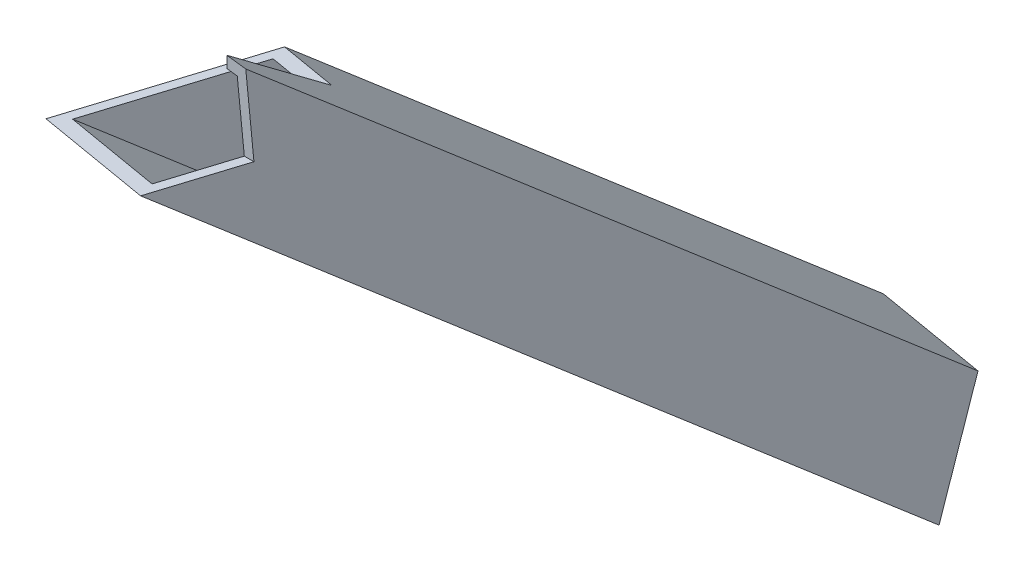
ISO-10303-21;
HEADER;
FILE_DESCRIPTION(('STEP AP214'),'2;1');
FILE_NAME('part.step','',(''),(''),'','','');
FILE_SCHEMA(('AUTOMOTIVE_DESIGN { 1 0 10303 214 1 1 1 1 }'));
ENDSEC;
DATA;
#1=APPLICATION_CONTEXT('core data for automotive mechanical design processes');
#2=APPLICATION_PROTOCOL_DEFINITION('international standard','automotive_design',2000,#1);
#3=PRODUCT_CONTEXT('',#1,'mechanical');
#4=PRODUCT('Part','Part','',(#3));
#5=PRODUCT_RELATED_PRODUCT_CATEGORY('part','',(#4));
#6=PRODUCT_DEFINITION_FORMATION('','',#4);
#7=PRODUCT_DEFINITION_CONTEXT('part definition',#1,'design');
#8=PRODUCT_DEFINITION('design','',#6,#7);
#9=PRODUCT_DEFINITION_SHAPE('','',#8);
#10=(LENGTH_UNIT() NAMED_UNIT(*) SI_UNIT(.MILLI.,.METRE.));
#11=(NAMED_UNIT(*) PLANE_ANGLE_UNIT() SI_UNIT($,.RADIAN.));
#12=(NAMED_UNIT(*) SI_UNIT($,.STERADIAN.) SOLID_ANGLE_UNIT());
#13=UNCERTAINTY_MEASURE_WITH_UNIT(LENGTH_MEASURE(1.E-05),#10,'distance_accuracy_value','');
#14=(GEOMETRIC_REPRESENTATION_CONTEXT(3) GLOBAL_UNCERTAINTY_ASSIGNED_CONTEXT((#13)) GLOBAL_UNIT_ASSIGNED_CONTEXT((#10,
#11,#12)) REPRESENTATION_CONTEXT('',''));
#15=CARTESIAN_POINT('',(0.,0.,0.));
#16=DIRECTION('',(0.,0.,1.));
#17=DIRECTION('',(1.,0.,0.));
#18=AXIS2_PLACEMENT_3D('',#15,#16,#17);
#19=CARTESIAN_POINT('',(-139.490711985,8.9814239699996,-452.98142397));
#20=DIRECTION('',(-0.101857603000028,-0.796284793999944,0.596284793999943));
#21=DIRECTION('',(0.,-0.599402291854355,-0.800447932422682));
#22=AXIS2_PLACEMENT_3D('',#19,#20,#21);
#23=PLANE('',#22);
#24=DIRECTION('',(-0.991917792269427,0.126882202768336,0.));
#25=VECTOR('',#24,1.);
#26=CARTESIAN_POINT('',(-140.152182836034,3.81029128241337,-460.));
#27=LINE('',#26,#25);
#28=CARTESIAN_POINT('',(-136.683281573,3.36656314599933,-460.));
#29=VERTEX_POINT('',#28);
#30=CARTESIAN_POINT('',(-140.,3.7908246556324,-460.));
#31=VERTEX_POINT('',#30);
#32=EDGE_CURVE('E58',#29,#31,#27,.T.);
#33=ORIENTED_EDGE('',*,*,#32,.F.);
#34=DIRECTION('',(0.298142396999973,-0.596284793999944,-0.74535599249993));
#35=VECTOR('',#34,1.);
#36=CARTESIAN_POINT('',(-139.490711985,8.9814239699996,-452.98142397));
#37=LINE('',#36,#35);
#38=CARTESIAN_POINT('',(-100.,-70.0000000000001,-551.708203932499));
#39=VERTEX_POINT('',#38);
#40=EDGE_CURVE('E212',#29,#39,#37,.T.);
#41=ORIENTED_EDGE('',*,*,#40,.T.);
#42=DIRECTION('',(0.985721919281302,0.,0.168381405886715));
#43=VECTOR('',#42,1.);
#44=CARTESIAN_POINT('',(-121.984660849387,-70.0000000000001,-555.463632344258));
#45=LINE('',#44,#43);
#46=CARTESIAN_POINT('',(-120.,-70.0000000000002,-555.124611797498));
#47=VERTEX_POINT('',#46);
#48=EDGE_CURVE('E187',#47,#39,#45,.T.);
#49=ORIENTED_EDGE('',*,*,#48,.F.);
#50=DIRECTION('',(0.298142396999973,-0.596284793999944,-0.74535599249993));
#51=VECTOR('',#50,1.);
#52=CARTESIAN_POINT('',(-158.472135955,6.94427190999894,-458.944271909999));
#53=LINE('',#52,#51);
#54=CARTESIAN_POINT('',(-150.,-10.,-480.124611797498));
#55=VERTEX_POINT('',#54);
#56=EDGE_CURVE('E170',#55,#47,#53,.T.);
#57=ORIENTED_EDGE('',*,*,#56,.F.);
#58=DIRECTION('',(-0.985721919281302,0.,-0.168381405886715));
#59=VECTOR('',#58,1.);
#60=CARTESIAN_POINT('',(-135.283522978484,-10.,-477.610737405429));
#61=LINE('',#60,#59);
#62=CARTESIAN_POINT('',(-140.,-10.,-478.416407864999));
#63=VERTEX_POINT('',#62);
#64=EDGE_CURVE('E199',#63,#55,#61,.T.);
#65=ORIENTED_EDGE('',*,*,#64,.F.);
#66=DIRECTION('',(0.,-0.599402291854355,-0.800447932422682));
#67=VECTOR('',#66,1.);
#68=CARTESIAN_POINT('',(-140.,9.02316418288764,-453.012680443099));
#69=LINE('',#68,#67);
#70=EDGE_CURVE('E80',#31,#63,#69,.T.);
#71=ORIENTED_EDGE('',*,*,#70,.F.);
#72=EDGE_LOOP('',(#33,#41,#49,#57,#65,#71));
#73=FACE_BOUND('',#72,.T.);
#74=ADVANCED_FACE('F41',(#73),#23,.F.);
#75=CARTESIAN_POINT('',(-141.527864045001,-6.94427190999933,-441.055728090001));
#76=DIRECTION('',(-0.949071198499986,-0.101857603000028,-0.298142396999973));
#77=DIRECTION('',(-0.299701145927178,0.,0.954033135236893));
#78=AXIS2_PLACEMENT_3D('',#75,#76,#77);
#79=PLANE('',#78);
#80=DIRECTION('',(0.299701145927178,0.,-0.954033135236893));
#81=VECTOR('',#80,1.);
#82=CARTESIAN_POINT('',(-141.229369580434,-10.,-440.961958670701));
#83=LINE('',#82,#81);
#84=CARTESIAN_POINT('',(-140.,-10.,-444.875388202502));
#85=VERTEX_POINT('',#84);
#86=CARTESIAN_POINT('',(-135.248735793345,-10.,-460.));
#87=VERTEX_POINT('',#86);
#88=EDGE_CURVE('E160',#85,#87,#83,.T.);
#89=ORIENTED_EDGE('',*,*,#88,.F.);
#90=DIRECTION('',(0.298142396999973,-0.596284793999944,-0.74535599249993));
#91=VECTOR('',#90,1.);
#92=CARTESIAN_POINT('',(-141.527864045001,-6.94427190999933,-441.055728090001));
#93=LINE('',#92,#91);
#94=CARTESIAN_POINT('',(-100.,-90.0000000000002,-544.875388202502));
#95=VERTEX_POINT('',#94);
#96=EDGE_CURVE('E210',#85,#95,#93,.T.);
#97=ORIENTED_EDGE('',*,*,#96,.T.);
#98=DIRECTION('',(0.,-0.94629851540018,0.32329416906498));
#99=VECTOR('',#98,1.);
#100=CARTESIAN_POINT('',(-100.,-47.3870220062147,-559.433719519401));
#101=LINE('',#100,#99);
#102=EDGE_CURVE('E183',#39,#95,#101,.T.);
#103=ORIENTED_EDGE('',*,*,#102,.F.);
#104=ORIENTED_EDGE('',*,*,#40,.F.);
#105=DIRECTION('',(-0.106710653684535,0.9942901168121,0.));
#106=VECTOR('',#105,1.);
#107=CARTESIAN_POINT('',(-135.644454124513,-6.31284401195058,-460.));
#108=LINE('',#107,#106);
#109=EDGE_CURVE('E167',#87,#29,#108,.T.);
#110=ORIENTED_EDGE('',*,*,#109,.F.);
#111=EDGE_LOOP('',(#89,#97,#103,#104,#110));
#112=FACE_BOUND('',#111,.T.);
#113=ADVANCED_FACE('F231',(#112),#79,.F.);
#114=CARTESIAN_POINT('',(-142.883405797801,-5.83318840439948,-442.486811595601));
#115=DIRECTION('',(-0.949071198499986,-0.101857603000028,-0.298142396999973));
#116=DIRECTION('',(-0.299701145927178,0.,0.954033135236893));
#117=AXIS2_PLACEMENT_3D('',#114,#115,#116);
#118=PLANE('',#117);
#119=DIRECTION('',(0.299701145927178,0.,-0.954033135236893));
#120=VECTOR('',#119,1.);
#121=CARTESIAN_POINT('',(-142.476376716826,-10.,-442.358946978023));
#122=LINE('',#121,#120);
#123=CARTESIAN_POINT('',(-140.8,-10.,-447.695326090101));
#124=VERTEX_POINT('',#123);
#125=CARTESIAN_POINT('',(-136.93459455982,-10.,-460.));
#126=VERTEX_POINT('',#125);
#127=EDGE_CURVE('E121',#124,#126,#122,.T.);
#128=ORIENTED_EDGE('',*,*,#127,.T.);
#129=DIRECTION('',(-0.106710653684535,0.9942901168121,0.));
#130=VECTOR('',#129,1.);
#131=CARTESIAN_POINT('',(-137.444438975147,-5.24945967653611,-460.));
#132=LINE('',#131,#130);
#133=CARTESIAN_POINT('',(-138.17395652132,1.54791304263929,-460.));
#134=VERTEX_POINT('',#133);
#135=EDGE_CURVE('E146',#126,#134,#132,.T.);
#136=ORIENTED_EDGE('',*,*,#135,.T.);
#137=DIRECTION('',(0.298142396999973,-0.596284793999944,-0.74535599249993));
#138=VECTOR('',#137,1.);
#139=CARTESIAN_POINT('',(-141.1721980674,7.54439613479954,-452.5043961348));
#140=LINE('',#139,#138);
#141=CARTESIAN_POINT('',(-101.6,-71.6000000000002,-551.434891303299));
#142=VERTEX_POINT('',#141);
#143=EDGE_CURVE('E150',#134,#142,#140,.T.);
#144=ORIENTED_EDGE('',*,*,#143,.T.);
#145=DIRECTION('',(0.,-0.94629851540018,0.32329416906498));
#146=VECTOR('',#145,1.);
#147=CARTESIAN_POINT('',(-101.6,-46.0378678936181,-560.167958220738));
#148=LINE('',#147,#146);
#149=CARTESIAN_POINT('',(-101.6,-88.4000000000002,-545.695326090102));
#150=VERTEX_POINT('',#149);
#151=EDGE_CURVE('E173',#142,#150,#148,.T.);
#152=ORIENTED_EDGE('',*,*,#151,.T.);
#153=DIRECTION('',(0.298142396999973,-0.596284793999944,-0.74535599249993));
#154=VECTOR('',#153,1.);
#155=CARTESIAN_POINT('',(-142.883405797801,-5.83318840439948,-442.486811595601));
#156=LINE('',#155,#154);
#157=EDGE_CURVE('E149',#124,#150,#156,.T.);
#158=ORIENTED_EDGE('',*,*,#157,.F.);
#159=EDGE_LOOP('',(#128,#136,#144,#152,#158));
#160=FACE_BOUND('',#159,.T.);
#161=ADVANCED_FACE('F145',(#160),#118,.T.);
#162=CARTESIAN_POINT('',(-141.1721980674,7.54439613479954,-452.5043961348));
#163=DIRECTION('',(-0.101857603000028,-0.796284793999944,0.596284793999943));
#164=DIRECTION('',(0.,-0.599402291854355,-0.800447932422682));
#165=AXIS2_PLACEMENT_3D('',#162,#163,#164);
#166=PLANE('',#165);
#167=ORIENTED_EDGE('',*,*,#143,.F.);
#168=DIRECTION('',(-0.991917792269427,0.126882202768336,0.));
#169=VECTOR('',#168,1.);
#170=CARTESIAN_POINT('',(-141.878626757,2.02179981399953,-460.));
#171=LINE('',#170,#169);
#172=CARTESIAN_POINT('',(-140.,1.7814933057734,-460.));
#173=VERTEX_POINT('',#172);
#174=EDGE_CURVE('E157',#134,#173,#171,.T.);
#175=ORIENTED_EDGE('',*,*,#174,.T.);
#176=DIRECTION('',(0.,-0.599402291854355,-0.800447932422682));
#177=VECTOR('',#176,1.);
#178=CARTESIAN_POINT('',(-140.,7.44832515837925,-452.432454961471));
#179=LINE('',#178,#177);
#180=CARTESIAN_POINT('',(-140.,-10.,-475.733126291999));
#181=VERTEX_POINT('',#180);
#182=EDGE_CURVE('E67',#173,#181,#179,.T.);
#183=ORIENTED_EDGE('',*,*,#182,.T.);
#184=DIRECTION('',(-0.985721919281302,0.,-0.168381405886715));
#185=VECTOR('',#184,1.);
#186=CARTESIAN_POINT('',(-137.283522978484,-10.,-475.269096618929));
#187=LINE('',#186,#185);
#188=CARTESIAN_POINT('',(-149.2,-10.,-477.304673909898));
#189=VERTEX_POINT('',#188);
#190=EDGE_CURVE('E172',#181,#189,#187,.T.);
#191=ORIENTED_EDGE('',*,*,#190,.T.);
#192=DIRECTION('',(0.298142396999973,-0.596284793999944,-0.74535599249993));
#193=VECTOR('',#192,1.);
#194=CARTESIAN_POINT('',(-157.1165942022,5.83318840439909,-457.513188404399));
#195=LINE('',#194,#193);
#196=CARTESIAN_POINT('',(-118.4,-71.6000000000002,-554.304673909898));
#197=VERTEX_POINT('',#196);
#198=EDGE_CURVE('E195',#189,#197,#195,.T.);
#199=ORIENTED_EDGE('',*,*,#198,.T.);
#200=DIRECTION('',(0.985721919281302,0.,0.168381405886715));
#201=VECTOR('',#200,1.);
#202=CARTESIAN_POINT('',(-123.630024525945,-71.6000000000002,-555.198068756127));
#203=LINE('',#202,#201);
#204=EDGE_CURVE('E176',#197,#142,#203,.T.);
#205=ORIENTED_EDGE('',*,*,#204,.T.);
#206=EDGE_LOOP('',(#167,#175,#183,#191,#199,#205));
#207=FACE_BOUND('',#206,.T.);
#208=ADVANCED_FACE('F233',(#207),#166,.T.);
#209=CARTESIAN_POINT('',(-140.,-10.,-825.));
#210=DIRECTION('',(-1.,0.,0.));
#211=DIRECTION('',(0.,0.,1.));
#212=AXIS2_PLACEMENT_3D('',#209,#210,#211);
#213=PLANE('',#212);
#214=ORIENTED_EDGE('',*,*,#182,.F.);
#215=DIRECTION('',(0.,1.,0.));
#216=VECTOR('',#215,1.);
#217=CARTESIAN_POINT('',(-140.,-10.,-460.));
#218=LINE('',#217,#216);
#219=EDGE_CURVE('E161',#173,#31,#218,.T.);
#220=ORIENTED_EDGE('',*,*,#219,.T.);
#221=ORIENTED_EDGE('',*,*,#70,.T.);
#222=DIRECTION('',(0.,0.,1.));
#223=VECTOR('',#222,1.);
#224=CARTESIAN_POINT('',(-140.,-10.,-825.));
#225=LINE('',#224,#223);
#226=EDGE_CURVE('E198',#63,#181,#225,.T.);
#227=ORIENTED_EDGE('',*,*,#226,.T.);
#228=EDGE_LOOP('',(#214,#220,#221,#227));
#229=FACE_BOUND('',#228,.T.);
#230=ADVANCED_FACE('F232',(#229),#213,.T.);
#231=CARTESIAN_POINT('',(-160.509288015,-8.98142396999999,-447.01857603));
#232=DIRECTION('',(0.949071198499986,0.101857603000028,0.298142396999973));
#233=DIRECTION('',(0.299701145927178,0.,-0.954033135236893));
#234=AXIS2_PLACEMENT_3D('',#231,#232,#233);
#235=PLANE('',#234);
#236=DIRECTION('',(-0.299701145927178,0.,0.954033135236893));
#237=VECTOR('',#236,1.);
#238=CARTESIAN_POINT('',(-160.409789860145,-10.,-446.987319556901));
#239=LINE('',#238,#237);
#240=CARTESIAN_POINT('',(-160.,-10.0000000000002,-448.291796067501));
#241=VERTEX_POINT('',#240);
#242=EDGE_CURVE('E50',#55,#241,#239,.T.);
#243=ORIENTED_EDGE('',*,*,#242,.F.);
#244=ORIENTED_EDGE('',*,*,#56,.T.);
#245=DIRECTION('',(0.,0.94629851540018,-0.32329416906498));
#246=VECTOR('',#245,1.);
#247=CARTESIAN_POINT('',(-120.,-48.432213203729,-562.493047441638));
#248=LINE('',#247,#246);
#249=CARTESIAN_POINT('',(-120.,-90.0000000000002,-548.291796067501));
#250=VERTEX_POINT('',#249);
#251=EDGE_CURVE('E182',#250,#47,#248,.T.);
#252=ORIENTED_EDGE('',*,*,#251,.F.);
#253=DIRECTION('',(0.298142396999973,-0.596284793999944,-0.74535599249993));
#254=VECTOR('',#253,1.);
#255=CARTESIAN_POINT('',(-160.509288015,-8.98142396999999,-447.01857603));
#256=LINE('',#255,#254);
#257=EDGE_CURVE('E45',#241,#250,#256,.T.);
#258=ORIENTED_EDGE('',*,*,#257,.F.);
#259=EDGE_LOOP('',(#243,#244,#252,#258));
#260=FACE_BOUND('',#259,.T.);
#261=ADVANCED_FACE('F217',(#260),#235,.F.);
#262=CARTESIAN_POINT('',(-141.527864045001,-6.94427190999933,-441.055728090001));
#263=DIRECTION('',(0.101857603000028,0.796284793999944,-0.596284793999943));
#264=DIRECTION('',(0.,0.599402291854355,0.800447932422682));
#265=AXIS2_PLACEMENT_3D('',#262,#263,#264);
#266=PLANE('',#265);
#267=DIRECTION('',(0.985721919281302,0.,0.168381405886715));
#268=VECTOR('',#267,1.);
#269=CARTESIAN_POINT('',(-140.850568935452,-10.,-445.020682722542));
#270=LINE('',#269,#268);
#271=EDGE_CURVE('E11',#241,#85,#270,.T.);
#272=ORIENTED_EDGE('',*,*,#271,.F.);
#273=ORIENTED_EDGE('',*,*,#257,.T.);
#274=DIRECTION('',(-0.985721919281302,0.,-0.168381405886715));
#275=VECTOR('',#274,1.);
#276=CARTESIAN_POINT('',(-123.118752763323,-90.0000000000002,-548.824542640981));
#277=LINE('',#276,#275);
#278=EDGE_CURVE('E179',#95,#250,#277,.T.);
#279=ORIENTED_EDGE('',*,*,#278,.F.);
#280=ORIENTED_EDGE('',*,*,#96,.F.);
#281=EDGE_LOOP('',(#272,#273,#279,#280));
#282=FACE_BOUND('',#281,.T.);
#283=ADVANCED_FACE('F229',(#282),#266,.F.);
#284=CARTESIAN_POINT('',(-142.883405797801,-5.83318840439948,-442.486811595601));
#285=DIRECTION('',(0.101857603000027,0.796284793999944,-0.596284793999944));
#286=DIRECTION('',(0.,0.599402291854356,0.800447932422682));
#287=AXIS2_PLACEMENT_3D('',#284,#285,#286);
#288=PLANE('',#287);
#289=DIRECTION('',(0.298142396999973,-0.596284793999944,-0.74535599249993));
#290=VECTOR('',#289,1.);
#291=CARTESIAN_POINT('',(-158.8278019326,-7.54439613479993,-447.4956038652));
#292=LINE('',#291,#290);
#293=CARTESIAN_POINT('',(-157.6,-10.,-450.5651086967));
#294=VERTEX_POINT('',#293);
#295=CARTESIAN_POINT('',(-118.4,-88.4000000000002,-548.5651086967));
#296=VERTEX_POINT('',#295);
#297=EDGE_CURVE('E92',#294,#296,#292,.T.);
#298=ORIENTED_EDGE('',*,*,#297,.F.);
#299=DIRECTION('',(0.985721919281302,0.,0.168381405886712));
#300=VECTOR('',#299,1.);
#301=CARTESIAN_POINT('',(-141.959841582337,-10.,-447.893450685304));
#302=LINE('',#301,#300);
#303=EDGE_CURVE('E202',#294,#124,#302,.T.);
#304=ORIENTED_EDGE('',*,*,#303,.T.);
#305=ORIENTED_EDGE('',*,*,#157,.T.);
#306=DIRECTION('',(-0.985721919281302,0.,-0.168381405886714));
#307=VECTOR('',#306,1.);
#308=CARTESIAN_POINT('',(-124.58266173365,-88.4000000000002,-549.621233405374));
#309=LINE('',#308,#307);
#310=EDGE_CURVE('E151',#150,#296,#309,.T.);
#311=ORIENTED_EDGE('',*,*,#310,.T.);
#312=EDGE_LOOP('',(#298,#304,#305,#311));
#313=FACE_BOUND('',#312,.T.);
#314=ADVANCED_FACE('F43',(#313),#288,.T.);
#315=CARTESIAN_POINT('',(-158.8278019326,-7.54439613479993,-447.4956038652));
#316=DIRECTION('',(0.949071198499986,0.101857603000028,0.298142396999973));
#317=DIRECTION('',(0.299701145927178,0.,-0.954033135236893));
#318=AXIS2_PLACEMENT_3D('',#315,#316,#317);
#319=PLANE('',#318);
#320=ORIENTED_EDGE('',*,*,#198,.F.);
#321=DIRECTION('',(-0.299701145927178,0.,0.954033135236893));
#322=VECTOR('',#321,1.);
#323=CARTESIAN_POINT('',(-158.587929751784,-10.,-447.42025012243));
#324=LINE('',#323,#322);
#325=EDGE_CURVE('E174',#189,#294,#324,.T.);
#326=ORIENTED_EDGE('',*,*,#325,.T.);
#327=ORIENTED_EDGE('',*,*,#297,.T.);
#328=DIRECTION('',(0.,0.94629851540018,-0.32329416906498));
#329=VECTOR('',#328,1.);
#330=CARTESIAN_POINT('',(-118.4,-46.9158284995301,-562.737793675417));
#331=LINE('',#330,#329);
#332=EDGE_CURVE('E186',#296,#197,#331,.T.);
#333=ORIENTED_EDGE('',*,*,#332,.T.);
#334=EDGE_LOOP('',(#320,#326,#327,#333));
#335=FACE_BOUND('',#334,.T.);
#336=ADVANCED_FACE('F240',(#335),#319,.T.);
#337=CARTESIAN_POINT('',(-110.,-80.,-550.));
#338=DIRECTION('',(0.159575689721233,-0.319151379442464,-0.934172358962716));
#339=DIRECTION('',(0.,0.94629851540018,-0.32329416906498));
#340=AXIS2_PLACEMENT_3D('',#337,#338,#339);
#341=PLANE('',#340);
#342=ORIENTED_EDGE('',*,*,#332,.F.);
#343=ORIENTED_EDGE('',*,*,#310,.F.);
#344=ORIENTED_EDGE('',*,*,#151,.F.);
#345=ORIENTED_EDGE('',*,*,#204,.F.);
#346=EDGE_LOOP('',(#342,#343,#344,#345));
#347=FACE_BOUND('',#346,.T.);
#348=ORIENTED_EDGE('',*,*,#102,.T.);
#349=ORIENTED_EDGE('',*,*,#278,.T.);
#350=ORIENTED_EDGE('',*,*,#251,.T.);
#351=ORIENTED_EDGE('',*,*,#48,.T.);
#352=EDGE_LOOP('',(#348,#349,#350,#351));
#353=FACE_BOUND('',#352,.T.);
#354=ADVANCED_FACE('F223',(#347,#353),#341,.T.);
#355=CARTESIAN_POINT('',(-160.,-10.,-825.));
#356=DIRECTION('',(0.,1.,0.));
#357=DIRECTION('',(0.,0.,1.));
#358=AXIS2_PLACEMENT_3D('',#355,#356,#357);
#359=PLANE('',#358);
#360=ORIENTED_EDGE('',*,*,#303,.F.);
#361=ORIENTED_EDGE('',*,*,#325,.F.);
#362=ORIENTED_EDGE('',*,*,#190,.F.);
#363=ORIENTED_EDGE('',*,*,#226,.F.);
#364=ORIENTED_EDGE('',*,*,#64,.T.);
#365=ORIENTED_EDGE('',*,*,#242,.T.);
#366=ORIENTED_EDGE('',*,*,#271,.T.);
#367=ORIENTED_EDGE('',*,*,#88,.T.);
#368=DIRECTION('',(1.,0.,0.));
#369=VECTOR('',#368,1.);
#370=CARTESIAN_POINT('',(-150.,-10.,-460.));
#371=LINE('',#370,#369);
#372=EDGE_CURVE('E155',#126,#87,#371,.T.);
#373=ORIENTED_EDGE('',*,*,#372,.F.);
#374=ORIENTED_EDGE('',*,*,#127,.F.);
#375=EDGE_LOOP('',(#360,#361,#362,#363,#364,#365,#366,#367,#373,#374));
#376=FACE_BOUND('',#375,.T.);
#377=ADVANCED_FACE('F159',(#376),#359,.T.);
#378=CARTESIAN_POINT('',(-150.,-10.,-460.));
#379=DIRECTION('',(0.,0.,1.));
#380=DIRECTION('',(1.,0.,0.));
#381=AXIS2_PLACEMENT_3D('',#378,#379,#380);
#382=PLANE('',#381);
#383=ORIENTED_EDGE('',*,*,#109,.T.);
#384=ORIENTED_EDGE('',*,*,#32,.T.);
#385=ORIENTED_EDGE('',*,*,#219,.F.);
#386=ORIENTED_EDGE('',*,*,#174,.F.);
#387=ORIENTED_EDGE('',*,*,#135,.F.);
#388=ORIENTED_EDGE('',*,*,#372,.T.);
#389=EDGE_LOOP('',(#383,#384,#385,#386,#387,#388));
#390=FACE_BOUND('',#389,.T.);
#391=ADVANCED_FACE('F154',(#390),#382,.T.);
#392=CLOSED_SHELL('',(#74,#113,#161,#208,#230,#261,#283,#314,#336,#354,#377,#391));
#393=MANIFOLD_SOLID_BREP('B2',#392);
#394=ADVANCED_BREP_SHAPE_REPRESENTATION('',(#18,#393),#14);
#395=SHAPE_DEFINITION_REPRESENTATION(#9,#394);
ENDSEC;
END-ISO-10303-21;
